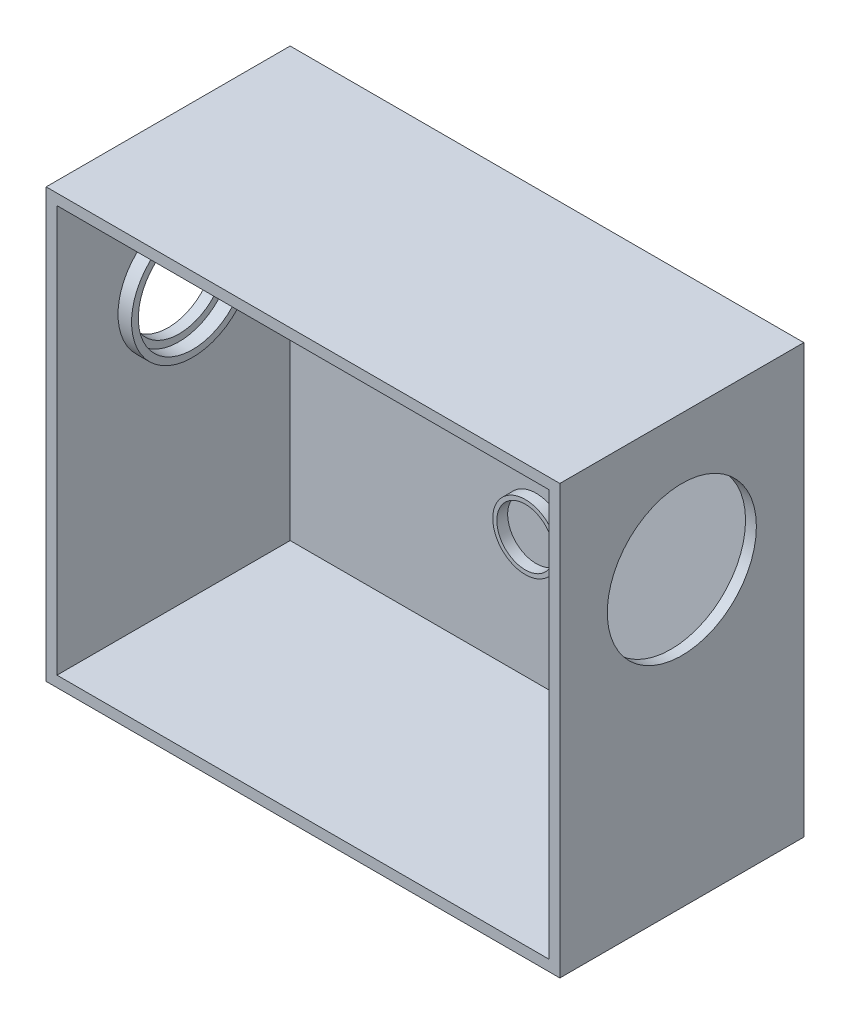
ISO-10303-21;
HEADER;
FILE_DESCRIPTION(('STEP AP214'),'2;1');
FILE_NAME('part.step','',(''),(''),'','','');
FILE_SCHEMA(('AUTOMOTIVE_DESIGN { 1 0 10303 214 1 1 1 1 }'));
ENDSEC;
DATA;
#1=APPLICATION_CONTEXT('core data for automotive mechanical design processes');
#2=APPLICATION_PROTOCOL_DEFINITION('international standard','automotive_design',2000,#1);
#3=PRODUCT_CONTEXT('',#1,'mechanical');
#4=PRODUCT('Part','Part','',(#3));
#5=PRODUCT_RELATED_PRODUCT_CATEGORY('part','',(#4));
#6=PRODUCT_DEFINITION_FORMATION('','',#4);
#7=PRODUCT_DEFINITION_CONTEXT('part definition',#1,'design');
#8=PRODUCT_DEFINITION('design','',#6,#7);
#9=PRODUCT_DEFINITION_SHAPE('','',#8);
#10=(LENGTH_UNIT() NAMED_UNIT(*) SI_UNIT(.MILLI.,.METRE.));
#11=(NAMED_UNIT(*) PLANE_ANGLE_UNIT() SI_UNIT($,.RADIAN.));
#12=(NAMED_UNIT(*) SI_UNIT($,.STERADIAN.) SOLID_ANGLE_UNIT());
#13=UNCERTAINTY_MEASURE_WITH_UNIT(LENGTH_MEASURE(1.E-05),#10,'distance_accuracy_value','');
#14=(GEOMETRIC_REPRESENTATION_CONTEXT(3) GLOBAL_UNCERTAINTY_ASSIGNED_CONTEXT((#13)) GLOBAL_UNIT_ASSIGNED_CONTEXT((#10,
#11,#12)) REPRESENTATION_CONTEXT('',''));
#15=CARTESIAN_POINT('',(0.,0.,0.));
#16=DIRECTION('',(0.,0.,1.));
#17=DIRECTION('',(1.,0.,0.));
#18=AXIS2_PLACEMENT_3D('',#15,#16,#17);
#19=CARTESIAN_POINT('',(-181.5,-158.,180.));
#20=DIRECTION('',(1.,0.,0.));
#21=DIRECTION('',(0.,0.,-1.));
#22=AXIS2_PLACEMENT_3D('',#19,#20,#21);
#23=PLANE('',#22);
#24=CARTESIAN_POINT('',(-181.5,57.9999999999999,90.));
#25=DIRECTION('',(1.,0.,0.));
#26=DIRECTION('',(0.,0.,-1.));
#27=AXIS2_PLACEMENT_3D('',#24,#25,#26);
#28=CIRCLE('',#27,35.);
#29=CARTESIAN_POINT('',(-181.5,57.9999999999999,55.));
#30=VERTEX_POINT('',#29);
#31=EDGE_CURVE('E193',#30,#30,#28,.T.);
#32=ORIENTED_EDGE('',*,*,#31,.F.);
#33=EDGE_LOOP('',(#32));
#34=FACE_BOUND('',#33,.T.);
#35=CARTESIAN_POINT('',(-181.5,57.9999999999999,90.));
#36=DIRECTION('',(1.,0.,0.));
#37=DIRECTION('',(0.,0.,-1.));
#38=AXIS2_PLACEMENT_3D('',#35,#36,#37);
#39=CIRCLE('',#38,40.);
#40=CARTESIAN_POINT('',(-181.5,57.9999999999999,50.));
#41=VERTEX_POINT('',#40);
#42=EDGE_CURVE('E48',#41,#41,#39,.F.);
#43=ORIENTED_EDGE('',*,*,#42,.F.);
#44=EDGE_LOOP('',(#43));
#45=FACE_BOUND('',#44,.T.);
#46=ADVANCED_FACE('F39',(#34,#45),#23,.T.);
#47=CARTESIAN_POINT('',(0.,0.,180.));
#48=DIRECTION('',(0.,0.,-1.));
#49=DIRECTION('',(-1.,0.,0.));
#50=AXIS2_PLACEMENT_3D('',#47,#48,#49);
#51=PLANE('',#50);
#52=DIRECTION('',(0.,-1.,0.));
#53=VECTOR('',#52,1.);
#54=CARTESIAN_POINT('',(-189.5,-158.,180.));
#55=LINE('',#54,#53);
#56=CARTESIAN_POINT('',(-189.5,158.,180.));
#57=VERTEX_POINT('',#56);
#58=CARTESIAN_POINT('',(-189.5,-158.,180.));
#59=VERTEX_POINT('',#58);
#60=EDGE_CURVE('E158',#57,#59,#55,.T.);
#61=ORIENTED_EDGE('',*,*,#60,.T.);
#62=DIRECTION('',(1.,0.,0.));
#63=VECTOR('',#62,1.);
#64=CARTESIAN_POINT('',(-189.5,-158.,180.));
#65=LINE('',#64,#63);
#66=CARTESIAN_POINT('',(189.5,-158.,180.));
#67=VERTEX_POINT('',#66);
#68=EDGE_CURVE('E93',#59,#67,#65,.T.);
#69=ORIENTED_EDGE('',*,*,#68,.T.);
#70=DIRECTION('',(0.,1.,0.));
#71=VECTOR('',#70,1.);
#72=CARTESIAN_POINT('',(189.5,-158.,180.));
#73=LINE('',#72,#71);
#74=CARTESIAN_POINT('',(189.5,158.,180.));
#75=VERTEX_POINT('',#74);
#76=EDGE_CURVE('E163',#67,#75,#73,.T.);
#77=ORIENTED_EDGE('',*,*,#76,.T.);
#78=DIRECTION('',(-1.,0.,0.));
#79=VECTOR('',#78,1.);
#80=CARTESIAN_POINT('',(-189.5,158.,180.));
#81=LINE('',#80,#79);
#82=EDGE_CURVE('E64',#75,#57,#81,.T.);
#83=ORIENTED_EDGE('',*,*,#82,.T.);
#84=EDGE_LOOP('',(#61,#69,#77,#83));
#85=FACE_BOUND('',#84,.T.);
#86=DIRECTION('',(0.,-1.,0.));
#87=VECTOR('',#86,1.);
#88=CARTESIAN_POINT('',(-181.5,0.,180.));
#89=LINE('',#88,#87);
#90=CARTESIAN_POINT('',(-181.5,150.,180.));
#91=VERTEX_POINT('',#90);
#92=CARTESIAN_POINT('',(-181.5,-150.,180.));
#93=VERTEX_POINT('',#92);
#94=EDGE_CURVE('E142',#91,#93,#89,.T.);
#95=ORIENTED_EDGE('',*,*,#94,.F.);
#96=DIRECTION('',(-1.,0.,0.));
#97=VECTOR('',#96,1.);
#98=CARTESIAN_POINT('',(0.,150.,180.));
#99=LINE('',#98,#97);
#100=CARTESIAN_POINT('',(181.5,150.,180.));
#101=VERTEX_POINT('',#100);
#102=EDGE_CURVE('E155',#101,#91,#99,.T.);
#103=ORIENTED_EDGE('',*,*,#102,.F.);
#104=DIRECTION('',(0.,1.,0.));
#105=VECTOR('',#104,1.);
#106=CARTESIAN_POINT('',(181.5,0.,180.));
#107=LINE('',#106,#105);
#108=CARTESIAN_POINT('',(181.5,-150.,180.));
#109=VERTEX_POINT('',#108);
#110=EDGE_CURVE('E152',#109,#101,#107,.T.);
#111=ORIENTED_EDGE('',*,*,#110,.F.);
#112=DIRECTION('',(1.,0.,0.));
#113=VECTOR('',#112,1.);
#114=CARTESIAN_POINT('',(0.,-150.,180.));
#115=LINE('',#114,#113);
#116=EDGE_CURVE('E131',#93,#109,#115,.T.);
#117=ORIENTED_EDGE('',*,*,#116,.F.);
#118=EDGE_LOOP('',(#95,#103,#111,#117));
#119=FACE_BOUND('',#118,.T.);
#120=ADVANCED_FACE('F246',(#85,#119),#51,.F.);
#121=CARTESIAN_POINT('',(-189.5,-158.,180.));
#122=DIRECTION('',(1.,0.,0.));
#123=DIRECTION('',(0.,0.,-1.));
#124=AXIS2_PLACEMENT_3D('',#121,#122,#123);
#125=PLANE('',#124);
#126=CARTESIAN_POINT('',(-189.5,57.9999999999999,90.));
#127=DIRECTION('',(-1.,0.,0.));
#128=DIRECTION('',(0.,0.,1.));
#129=AXIS2_PLACEMENT_3D('',#126,#127,#128);
#130=CIRCLE('',#129,35.);
#131=CARTESIAN_POINT('',(-189.5,57.9999999999999,125.));
#132=VERTEX_POINT('',#131);
#133=EDGE_CURVE('E197',#132,#132,#130,.T.);
#134=ORIENTED_EDGE('',*,*,#133,.F.);
#135=EDGE_LOOP('',(#134));
#136=FACE_BOUND('',#135,.T.);
#137=DIRECTION('',(0.,-1.,0.));
#138=VECTOR('',#137,1.);
#139=CARTESIAN_POINT('',(-189.5,-158.,0.));
#140=LINE('',#139,#138);
#141=CARTESIAN_POINT('',(-189.5,158.,0.));
#142=VERTEX_POINT('',#141);
#143=CARTESIAN_POINT('',(-189.5,-158.,0.));
#144=VERTEX_POINT('',#143);
#145=EDGE_CURVE('E169',#142,#144,#140,.T.);
#146=ORIENTED_EDGE('',*,*,#145,.T.);
#147=DIRECTION('',(0.,0.,-1.));
#148=VECTOR('',#147,1.);
#149=CARTESIAN_POINT('',(-189.5,-158.,180.));
#150=LINE('',#149,#148);
#151=EDGE_CURVE('E190',#59,#144,#150,.T.);
#152=ORIENTED_EDGE('',*,*,#151,.F.);
#153=ORIENTED_EDGE('',*,*,#60,.F.);
#154=DIRECTION('',(0.,0.,-1.));
#155=VECTOR('',#154,1.);
#156=CARTESIAN_POINT('',(-189.5,158.,180.));
#157=LINE('',#156,#155);
#158=EDGE_CURVE('E168',#57,#142,#157,.T.);
#159=ORIENTED_EDGE('',*,*,#158,.T.);
#160=EDGE_LOOP('',(#146,#152,#153,#159));
#161=FACE_BOUND('',#160,.T.);
#162=ADVANCED_FACE('F41',(#136,#161),#125,.F.);
#163=CARTESIAN_POINT('',(-189.5,-158.,180.));
#164=DIRECTION('',(0.,1.,0.));
#165=DIRECTION('',(0.,0.,1.));
#166=AXIS2_PLACEMENT_3D('',#163,#164,#165);
#167=PLANE('',#166);
#168=DIRECTION('',(1.,0.,0.));
#169=VECTOR('',#168,1.);
#170=CARTESIAN_POINT('',(-189.5,-158.,0.));
#171=LINE('',#170,#169);
#172=CARTESIAN_POINT('',(189.5,-158.,0.));
#173=VERTEX_POINT('',#172);
#174=EDGE_CURVE('E173',#144,#173,#171,.T.);
#175=ORIENTED_EDGE('',*,*,#174,.T.);
#176=DIRECTION('',(0.,0.,-1.));
#177=VECTOR('',#176,1.);
#178=CARTESIAN_POINT('',(189.5,-158.,180.));
#179=LINE('',#178,#177);
#180=EDGE_CURVE('E186',#67,#173,#179,.T.);
#181=ORIENTED_EDGE('',*,*,#180,.F.);
#182=ORIENTED_EDGE('',*,*,#68,.F.);
#183=ORIENTED_EDGE('',*,*,#151,.T.);
#184=EDGE_LOOP('',(#175,#181,#182,#183));
#185=FACE_BOUND('',#184,.T.);
#186=ADVANCED_FACE('F253',(#185),#167,.F.);
#187=CARTESIAN_POINT('',(189.5,-158.,180.));
#188=DIRECTION('',(-1.,0.,0.));
#189=DIRECTION('',(0.,0.,1.));
#190=AXIS2_PLACEMENT_3D('',#187,#188,#189);
#191=PLANE('',#190);
#192=CARTESIAN_POINT('',(189.5,58.,90.));
#193=DIRECTION('',(1.,0.,0.));
#194=DIRECTION('',(0.,0.,-1.));
#195=AXIS2_PLACEMENT_3D('',#192,#193,#194);
#196=CIRCLE('',#195,55.);
#197=CARTESIAN_POINT('',(189.5,58.,35.));
#198=VERTEX_POINT('',#197);
#199=EDGE_CURVE('E204',#198,#198,#196,.T.);
#200=ORIENTED_EDGE('',*,*,#199,.F.);
#201=EDGE_LOOP('',(#200));
#202=FACE_BOUND('',#201,.T.);
#203=DIRECTION('',(0.,1.,0.));
#204=VECTOR('',#203,1.);
#205=CARTESIAN_POINT('',(189.5,-158.,0.));
#206=LINE('',#205,#204);
#207=CARTESIAN_POINT('',(189.5,158.,0.));
#208=VERTEX_POINT('',#207);
#209=EDGE_CURVE('E176',#173,#208,#206,.T.);
#210=ORIENTED_EDGE('',*,*,#209,.T.);
#211=DIRECTION('',(0.,0.,-1.));
#212=VECTOR('',#211,1.);
#213=CARTESIAN_POINT('',(189.5,158.,180.));
#214=LINE('',#213,#212);
#215=EDGE_CURVE('E183',#75,#208,#214,.T.);
#216=ORIENTED_EDGE('',*,*,#215,.F.);
#217=ORIENTED_EDGE('',*,*,#76,.F.);
#218=ORIENTED_EDGE('',*,*,#180,.T.);
#219=EDGE_LOOP('',(#210,#216,#217,#218));
#220=FACE_BOUND('',#219,.T.);
#221=ADVANCED_FACE('F267',(#202,#220),#191,.F.);
#222=CARTESIAN_POINT('',(-189.5,158.,180.));
#223=DIRECTION('',(0.,-1.,0.));
#224=DIRECTION('',(0.,0.,-1.));
#225=AXIS2_PLACEMENT_3D('',#222,#223,#224);
#226=PLANE('',#225);
#227=DIRECTION('',(-1.,0.,0.));
#228=VECTOR('',#227,1.);
#229=CARTESIAN_POINT('',(-189.5,158.,0.));
#230=LINE('',#229,#228);
#231=EDGE_CURVE('E85',#208,#142,#230,.T.);
#232=ORIENTED_EDGE('',*,*,#231,.T.);
#233=ORIENTED_EDGE('',*,*,#158,.F.);
#234=ORIENTED_EDGE('',*,*,#82,.F.);
#235=ORIENTED_EDGE('',*,*,#215,.T.);
#236=EDGE_LOOP('',(#232,#233,#234,#235));
#237=FACE_BOUND('',#236,.T.);
#238=ADVANCED_FACE('F263',(#237),#226,.F.);
#239=CARTESIAN_POINT('',(0.,0.,0.));
#240=DIRECTION('',(0.,0.,-1.));
#241=DIRECTION('',(-1.,0.,0.));
#242=AXIS2_PLACEMENT_3D('',#239,#240,#241);
#243=PLANE('',#242);
#244=ORIENTED_EDGE('',*,*,#145,.F.);
#245=ORIENTED_EDGE('',*,*,#231,.F.);
#246=ORIENTED_EDGE('',*,*,#209,.F.);
#247=ORIENTED_EDGE('',*,*,#174,.F.);
#248=EDGE_LOOP('',(#244,#245,#246,#247));
#249=FACE_BOUND('',#248,.T.);
#250=ADVANCED_FACE('F260',(#249),#243,.T.);
#251=CARTESIAN_POINT('',(-181.5,57.9999999999999,90.));
#252=DIRECTION('',(1.,0.,0.));
#253=DIRECTION('',(0.,0.,-1.));
#254=AXIS2_PLACEMENT_3D('',#251,#252,#253);
#255=CIRCLE('',#254,45.);
#256=CARTESIAN_POINT('',(-181.5,57.9999999999999,45.));
#257=VERTEX_POINT('',#256);
#258=EDGE_CURVE('E210',#257,#257,#255,.T.);
#259=ORIENTED_EDGE('',*,*,#258,.F.);
#260=EDGE_LOOP('',(#259));
#261=FACE_BOUND('',#260,.T.);
#262=DIRECTION('',(0.,-1.,0.));
#263=VECTOR('',#262,1.);
#264=CARTESIAN_POINT('',(-181.5,0.,8.));
#265=LINE('',#264,#263);
#266=CARTESIAN_POINT('',(-181.5,150.,8.));
#267=VERTEX_POINT('',#266);
#268=CARTESIAN_POINT('',(-181.5,-150.,8.));
#269=VERTEX_POINT('',#268);
#270=EDGE_CURVE('E121',#267,#269,#265,.T.);
#271=ORIENTED_EDGE('',*,*,#270,.F.);
#272=DIRECTION('',(0.,0.,-1.));
#273=VECTOR('',#272,1.);
#274=CARTESIAN_POINT('',(-181.5,150.,180.));
#275=LINE('',#274,#273);
#276=EDGE_CURVE('E146',#91,#267,#275,.T.);
#277=ORIENTED_EDGE('',*,*,#276,.F.);
#278=ORIENTED_EDGE('',*,*,#94,.T.);
#279=DIRECTION('',(0.,0.,-1.));
#280=VECTOR('',#279,1.);
#281=CARTESIAN_POINT('',(-181.5,-150.,180.));
#282=LINE('',#281,#280);
#283=EDGE_CURVE('E135',#93,#269,#282,.T.);
#284=ORIENTED_EDGE('',*,*,#283,.T.);
#285=EDGE_LOOP('',(#271,#277,#278,#284));
#286=FACE_BOUND('',#285,.T.);
#287=ADVANCED_FACE('F244',(#261,#286),#23,.T.);
#288=CARTESIAN_POINT('',(-189.5,-150.,180.));
#289=DIRECTION('',(0.,1.,0.));
#290=DIRECTION('',(0.,0.,1.));
#291=AXIS2_PLACEMENT_3D('',#288,#289,#290);
#292=PLANE('',#291);
#293=DIRECTION('',(1.,0.,0.));
#294=VECTOR('',#293,1.);
#295=CARTESIAN_POINT('',(0.,-150.,8.));
#296=LINE('',#295,#294);
#297=CARTESIAN_POINT('',(181.5,-150.,8.));
#298=VERTEX_POINT('',#297);
#299=EDGE_CURVE('E115',#269,#298,#296,.T.);
#300=ORIENTED_EDGE('',*,*,#299,.F.);
#301=ORIENTED_EDGE('',*,*,#283,.F.);
#302=ORIENTED_EDGE('',*,*,#116,.T.);
#303=DIRECTION('',(0.,0.,-1.));
#304=VECTOR('',#303,1.);
#305=CARTESIAN_POINT('',(181.5,-150.,180.));
#306=LINE('',#305,#304);
#307=EDGE_CURVE('E128',#109,#298,#306,.T.);
#308=ORIENTED_EDGE('',*,*,#307,.T.);
#309=EDGE_LOOP('',(#300,#301,#302,#308));
#310=FACE_BOUND('',#309,.T.);
#311=ADVANCED_FACE('F129',(#310),#292,.T.);
#312=CARTESIAN_POINT('',(181.5,-158.,180.));
#313=DIRECTION('',(-1.,0.,0.));
#314=DIRECTION('',(0.,0.,1.));
#315=AXIS2_PLACEMENT_3D('',#312,#313,#314);
#316=PLANE('',#315);
#317=CARTESIAN_POINT('',(181.5,58.,90.));
#318=DIRECTION('',(-1.,0.,0.));
#319=DIRECTION('',(0.,0.,1.));
#320=AXIS2_PLACEMENT_3D('',#317,#318,#319);
#321=CIRCLE('',#320,55.);
#322=CARTESIAN_POINT('',(181.5,58.,145.));
#323=VERTEX_POINT('',#322);
#324=EDGE_CURVE('E200',#323,#323,#321,.T.);
#325=ORIENTED_EDGE('',*,*,#324,.F.);
#326=EDGE_LOOP('',(#325));
#327=FACE_BOUND('',#326,.T.);
#328=DIRECTION('',(0.,1.,0.));
#329=VECTOR('',#328,1.);
#330=CARTESIAN_POINT('',(181.5,0.,8.));
#331=LINE('',#330,#329);
#332=CARTESIAN_POINT('',(181.5,150.,8.));
#333=VERTEX_POINT('',#332);
#334=EDGE_CURVE('E119',#298,#333,#331,.T.);
#335=ORIENTED_EDGE('',*,*,#334,.F.);
#336=ORIENTED_EDGE('',*,*,#307,.F.);
#337=ORIENTED_EDGE('',*,*,#110,.T.);
#338=DIRECTION('',(0.,0.,-1.));
#339=VECTOR('',#338,1.);
#340=CARTESIAN_POINT('',(181.5,150.,180.));
#341=LINE('',#340,#339);
#342=EDGE_CURVE('E55',#101,#333,#341,.T.);
#343=ORIENTED_EDGE('',*,*,#342,.T.);
#344=EDGE_LOOP('',(#335,#336,#337,#343));
#345=FACE_BOUND('',#344,.T.);
#346=ADVANCED_FACE('F137',(#327,#345),#316,.T.);
#347=CARTESIAN_POINT('',(-189.5,150.,180.));
#348=DIRECTION('',(0.,-1.,0.));
#349=DIRECTION('',(0.,0.,-1.));
#350=AXIS2_PLACEMENT_3D('',#347,#348,#349);
#351=PLANE('',#350);
#352=DIRECTION('',(-1.,0.,0.));
#353=VECTOR('',#352,1.);
#354=CARTESIAN_POINT('',(0.,150.,8.));
#355=LINE('',#354,#353);
#356=EDGE_CURVE('E139',#333,#267,#355,.T.);
#357=ORIENTED_EDGE('',*,*,#356,.F.);
#358=ORIENTED_EDGE('',*,*,#342,.F.);
#359=ORIENTED_EDGE('',*,*,#102,.T.);
#360=ORIENTED_EDGE('',*,*,#276,.T.);
#361=EDGE_LOOP('',(#357,#358,#359,#360));
#362=FACE_BOUND('',#361,.T.);
#363=ADVANCED_FACE('F240',(#362),#351,.T.);
#364=CARTESIAN_POINT('',(0.,0.,8.));
#365=DIRECTION('',(0.,0.,-1.));
#366=DIRECTION('',(-1.,0.,0.));
#367=AXIS2_PLACEMENT_3D('',#364,#365,#366);
#368=PLANE('',#367);
#369=CARTESIAN_POINT('',(0.,-53.,8.));
#370=DIRECTION('',(0.,0.,-1.));
#371=DIRECTION('',(-1.,0.,0.));
#372=AXIS2_PLACEMENT_3D('',#369,#370,#371);
#373=CIRCLE('',#372,24.);
#374=CARTESIAN_POINT('',(-24.,-53.,8.));
#375=VERTEX_POINT('',#374);
#376=EDGE_CURVE('E11',#375,#375,#373,.F.);
#377=ORIENTED_EDGE('',*,*,#376,.F.);
#378=EDGE_LOOP('',(#377));
#379=FACE_BOUND('',#378,.T.);
#380=ORIENTED_EDGE('',*,*,#270,.T.);
#381=ORIENTED_EDGE('',*,*,#299,.T.);
#382=ORIENTED_EDGE('',*,*,#334,.T.);
#383=ORIENTED_EDGE('',*,*,#356,.T.);
#384=EDGE_LOOP('',(#380,#381,#382,#383));
#385=FACE_BOUND('',#384,.T.);
#386=ADVANCED_FACE('F117',(#379,#385),#368,.F.);
#387=CARTESIAN_POINT('',(-169.5,57.9999999999999,90.));
#388=DIRECTION('',(-1.,0.,0.));
#389=DIRECTION('',(0.,0.,1.));
#390=AXIS2_PLACEMENT_3D('',#387,#388,#389);
#391=CYLINDRICAL_SURFACE('',#390,35.);
#392=ORIENTED_EDGE('',*,*,#31,.T.);
#393=EDGE_LOOP('',(#392));
#394=FACE_BOUND('',#393,.T.);
#395=ORIENTED_EDGE('',*,*,#133,.T.);
#396=EDGE_LOOP('',(#395));
#397=FACE_BOUND('',#396,.T.);
#398=ADVANCED_FACE('F329',(#394,#397),#391,.F.);
#399=CARTESIAN_POINT('',(-171.5,57.9999999999999,90.));
#400=DIRECTION('',(1.,0.,0.));
#401=DIRECTION('',(0.,0.,-1.));
#402=AXIS2_PLACEMENT_3D('',#399,#400,#401);
#403=PLANE('',#402);
#404=CARTESIAN_POINT('',(-171.5,57.9999999999999,90.));
#405=DIRECTION('',(1.,0.,0.));
#406=DIRECTION('',(0.,0.,-1.));
#407=AXIS2_PLACEMENT_3D('',#404,#405,#406);
#408=CIRCLE('',#407,45.);
#409=CARTESIAN_POINT('',(-171.5,57.9999999999999,45.));
#410=VERTEX_POINT('',#409);
#411=EDGE_CURVE('E223',#410,#410,#408,.T.);
#412=ORIENTED_EDGE('',*,*,#411,.T.);
#413=EDGE_LOOP('',(#412));
#414=FACE_BOUND('',#413,.T.);
#415=CARTESIAN_POINT('',(-171.5,57.9999999999999,90.));
#416=DIRECTION('',(1.,0.,0.));
#417=DIRECTION('',(0.,0.,-1.));
#418=AXIS2_PLACEMENT_3D('',#415,#416,#417);
#419=CIRCLE('',#418,40.);
#420=CARTESIAN_POINT('',(-171.5,57.9999999999999,50.));
#421=VERTEX_POINT('',#420);
#422=EDGE_CURVE('E203',#421,#421,#419,.T.);
#423=ORIENTED_EDGE('',*,*,#422,.F.);
#424=EDGE_LOOP('',(#423));
#425=FACE_BOUND('',#424,.T.);
#426=ADVANCED_FACE('F338',(#414,#425),#403,.T.);
#427=CARTESIAN_POINT('',(-171.5,57.9999999999999,90.));
#428=DIRECTION('',(-1.,0.,0.));
#429=DIRECTION('',(0.,0.,1.));
#430=AXIS2_PLACEMENT_3D('',#427,#428,#429);
#431=CYLINDRICAL_SURFACE('',#430,45.);
#432=ORIENTED_EDGE('',*,*,#411,.F.);
#433=EDGE_LOOP('',(#432));
#434=FACE_BOUND('',#433,.T.);
#435=ORIENTED_EDGE('',*,*,#258,.T.);
#436=EDGE_LOOP('',(#435));
#437=FACE_BOUND('',#436,.T.);
#438=ADVANCED_FACE('F345',(#434,#437),#431,.T.);
#439=CARTESIAN_POINT('',(-171.5,57.9999999999999,90.));
#440=DIRECTION('',(-1.,0.,0.));
#441=DIRECTION('',(0.,0.,1.));
#442=AXIS2_PLACEMENT_3D('',#439,#440,#441);
#443=CYLINDRICAL_SURFACE('',#442,40.);
#444=ORIENTED_EDGE('',*,*,#422,.T.);
#445=EDGE_LOOP('',(#444));
#446=FACE_BOUND('',#445,.T.);
#447=ORIENTED_EDGE('',*,*,#42,.T.);
#448=EDGE_LOOP('',(#447));
#449=FACE_BOUND('',#448,.T.);
#450=ADVANCED_FACE('F353',(#446,#449),#443,.F.);
#451=CARTESIAN_POINT('',(179.5,58.,90.));
#452=DIRECTION('',(1.,0.,0.));
#453=DIRECTION('',(0.,0.,-1.));
#454=AXIS2_PLACEMENT_3D('',#451,#452,#453);
#455=CYLINDRICAL_SURFACE('',#454,55.);
#456=ORIENTED_EDGE('',*,*,#324,.T.);
#457=EDGE_LOOP('',(#456));
#458=FACE_BOUND('',#457,.T.);
#459=ORIENTED_EDGE('',*,*,#199,.T.);
#460=EDGE_LOOP('',(#459));
#461=FACE_BOUND('',#460,.T.);
#462=ADVANCED_FACE('F360',(#458,#461),#455,.F.);
#463=CARTESIAN_POINT('',(0.,-53.,16.));
#464=DIRECTION('',(0.,0.,1.));
#465=DIRECTION('',(1.,0.,0.));
#466=AXIS2_PLACEMENT_3D('',#463,#464,#465);
#467=PLANE('',#466);
#468=CARTESIAN_POINT('',(0.,-53.,16.));
#469=DIRECTION('',(0.,0.,1.));
#470=DIRECTION('',(1.,0.,0.));
#471=AXIS2_PLACEMENT_3D('',#468,#469,#470);
#472=CIRCLE('',#471,24.);
#473=CARTESIAN_POINT('',(24.,-53.,16.));
#474=VERTEX_POINT('',#473);
#475=EDGE_CURVE('E213',#474,#474,#472,.T.);
#476=ORIENTED_EDGE('',*,*,#475,.T.);
#477=EDGE_LOOP('',(#476));
#478=FACE_BOUND('',#477,.T.);
#479=CARTESIAN_POINT('',(0.,-53.,16.));
#480=DIRECTION('',(0.,0.,1.));
#481=DIRECTION('',(1.,0.,0.));
#482=AXIS2_PLACEMENT_3D('',#479,#480,#481);
#483=CIRCLE('',#482,21.);
#484=CARTESIAN_POINT('',(21.,-53.,16.));
#485=VERTEX_POINT('',#484);
#486=EDGE_CURVE('E219',#485,#485,#483,.T.);
#487=ORIENTED_EDGE('',*,*,#486,.F.);
#488=EDGE_LOOP('',(#487));
#489=FACE_BOUND('',#488,.T.);
#490=ADVANCED_FACE('F367',(#478,#489),#467,.T.);
#491=CARTESIAN_POINT('',(0.,-53.,16.));
#492=DIRECTION('',(0.,0.,-1.));
#493=DIRECTION('',(-1.,0.,0.));
#494=AXIS2_PLACEMENT_3D('',#491,#492,#493);
#495=CYLINDRICAL_SURFACE('',#494,24.);
#496=ORIENTED_EDGE('',*,*,#475,.F.);
#497=EDGE_LOOP('',(#496));
#498=FACE_BOUND('',#497,.T.);
#499=ORIENTED_EDGE('',*,*,#376,.T.);
#500=EDGE_LOOP('',(#499));
#501=FACE_BOUND('',#500,.T.);
#502=ADVANCED_FACE('F373',(#498,#501),#495,.T.);
#503=CARTESIAN_POINT('',(0.,-53.,16.));
#504=DIRECTION('',(0.,0.,-1.));
#505=DIRECTION('',(-1.,0.,0.));
#506=AXIS2_PLACEMENT_3D('',#503,#504,#505);
#507=CYLINDRICAL_SURFACE('',#506,21.);
#508=ORIENTED_EDGE('',*,*,#486,.T.);
#509=EDGE_LOOP('',(#508));
#510=FACE_BOUND('',#509,.T.);
#511=CARTESIAN_POINT('',(0.,-53.,8.));
#512=DIRECTION('',(0.,0.,1.));
#513=DIRECTION('',(1.,0.,0.));
#514=AXIS2_PLACEMENT_3D('',#511,#512,#513);
#515=CIRCLE('',#514,21.);
#516=CARTESIAN_POINT('',(21.,-53.,8.));
#517=VERTEX_POINT('',#516);
#518=EDGE_CURVE('E449',#517,#517,#515,.T.);
#519=ORIENTED_EDGE('',*,*,#518,.F.);
#520=EDGE_LOOP('',(#519));
#521=FACE_BOUND('',#520,.T.);
#522=ADVANCED_FACE('F381',(#510,#521),#507,.F.);
#523=ORIENTED_EDGE('',*,*,#518,.T.);
#524=EDGE_LOOP('',(#523));
#525=FACE_BOUND('',#524,.T.);
#526=ADVANCED_FACE('F331',(#525),#368,.F.);
#527=CLOSED_SHELL('',(#46,#120,#162,#186,#221,#238,#250,#287,#311,#346,#363,#386,#398,#426,#438,
#450,#462,#490,#502,#522,#526));
#528=MANIFOLD_SOLID_BREP('B2',#527);
#529=ADVANCED_BREP_SHAPE_REPRESENTATION('',(#18,#528),#14);
#530=SHAPE_DEFINITION_REPRESENTATION(#9,#529);
ENDSEC;
END-ISO-10303-21;
